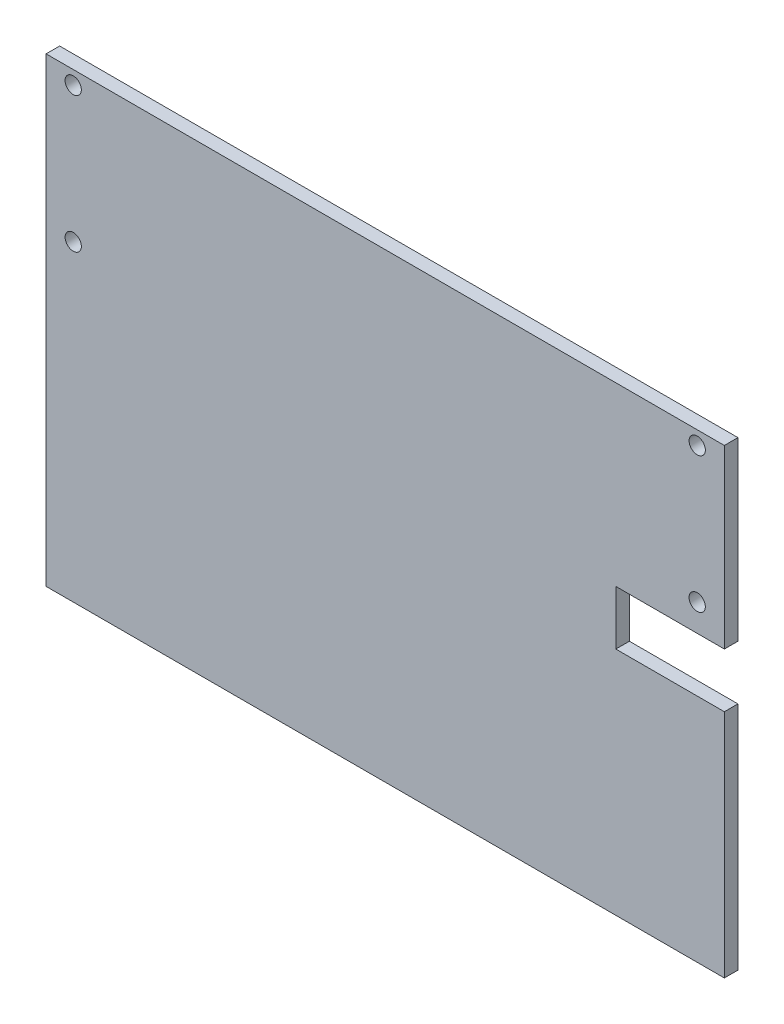
ISO-10303-21;
HEADER;
FILE_DESCRIPTION(('STEP AP214'),'2;1');
FILE_NAME('part.step','',(''),(''),'','','');
FILE_SCHEMA(('AUTOMOTIVE_DESIGN { 1 0 10303 214 1 1 1 1 }'));
ENDSEC;
DATA;
#1=APPLICATION_CONTEXT('core data for automotive mechanical design processes');
#2=APPLICATION_PROTOCOL_DEFINITION('international standard','automotive_design',2000,#1);
#3=PRODUCT_CONTEXT('',#1,'mechanical');
#4=PRODUCT('Part','Part','',(#3));
#5=PRODUCT_RELATED_PRODUCT_CATEGORY('part','',(#4));
#6=PRODUCT_DEFINITION_FORMATION('','',#4);
#7=PRODUCT_DEFINITION_CONTEXT('part definition',#1,'design');
#8=PRODUCT_DEFINITION('design','',#6,#7);
#9=PRODUCT_DEFINITION_SHAPE('','',#8);
#10=(LENGTH_UNIT() NAMED_UNIT(*) SI_UNIT(.MILLI.,.METRE.));
#11=(NAMED_UNIT(*) PLANE_ANGLE_UNIT() SI_UNIT($,.RADIAN.));
#12=(NAMED_UNIT(*) SI_UNIT($,.STERADIAN.) SOLID_ANGLE_UNIT());
#13=UNCERTAINTY_MEASURE_WITH_UNIT(LENGTH_MEASURE(1.E-05),#10,'distance_accuracy_value','');
#14=(GEOMETRIC_REPRESENTATION_CONTEXT(3) GLOBAL_UNCERTAINTY_ASSIGNED_CONTEXT((#13)) GLOBAL_UNIT_ASSIGNED_CONTEXT((#10,
#11,#12)) REPRESENTATION_CONTEXT('',''));
#15=CARTESIAN_POINT('',(0.,0.,0.));
#16=DIRECTION('',(0.,0.,1.));
#17=DIRECTION('',(1.,0.,0.));
#18=AXIS2_PLACEMENT_3D('',#15,#16,#17);
#19=CARTESIAN_POINT('',(250.,0.,5.));
#20=DIRECTION('',(-1.,0.,0.));
#21=DIRECTION('',(0.,0.,1.));
#22=AXIS2_PLACEMENT_3D('',#19,#20,#21);
#23=PLANE('',#22);
#24=DIRECTION('',(0.,1.,0.));
#25=VECTOR('',#24,1.);
#26=CARTESIAN_POINT('',(250.,0.,0.));
#27=LINE('',#26,#25);
#28=CARTESIAN_POINT('',(250.,-170.,0.));
#29=VERTEX_POINT('',#28);
#30=CARTESIAN_POINT('',(250.,-85.,0.));
#31=VERTEX_POINT('',#30);
#32=EDGE_CURVE('E143',#29,#31,#27,.T.);
#33=ORIENTED_EDGE('',*,*,#32,.T.);
#34=DIRECTION('',(0.,0.,1.));
#35=VECTOR('',#34,1.);
#36=CARTESIAN_POINT('',(250.,-85.,5.));
#37=LINE('',#36,#35);
#38=CARTESIAN_POINT('',(250.,-85.,5.));
#39=VERTEX_POINT('',#38);
#40=EDGE_CURVE('E41',#31,#39,#37,.T.);
#41=ORIENTED_EDGE('',*,*,#40,.T.);
#42=DIRECTION('',(0.,1.,0.));
#43=VECTOR('',#42,1.);
#44=CARTESIAN_POINT('',(250.,0.,5.));
#45=LINE('',#44,#43);
#46=CARTESIAN_POINT('',(250.,-170.,5.));
#47=VERTEX_POINT('',#46);
#48=EDGE_CURVE('E127',#47,#39,#45,.T.);
#49=ORIENTED_EDGE('',*,*,#48,.F.);
#50=DIRECTION('',(0.,0.,-1.));
#51=VECTOR('',#50,1.);
#52=CARTESIAN_POINT('',(250.,-170.,5.));
#53=LINE('',#52,#51);
#54=EDGE_CURVE('E149',#47,#29,#53,.T.);
#55=ORIENTED_EDGE('',*,*,#54,.T.);
#56=EDGE_LOOP('',(#33,#41,#49,#55));
#57=FACE_BOUND('',#56,.T.);
#58=ADVANCED_FACE('F33',(#57),#23,.F.);
#59=CARTESIAN_POINT('',(0.,0.,5.));
#60=DIRECTION('',(0.,0.,1.));
#61=DIRECTION('',(1.,0.,0.));
#62=AXIS2_PLACEMENT_3D('',#59,#60,#61);
#63=PLANE('',#62);
#64=DIRECTION('',(1.,0.,0.));
#65=VECTOR('',#64,1.);
#66=CARTESIAN_POINT('',(210.,-85.,5.));
#67=LINE('',#66,#65);
#68=CARTESIAN_POINT('',(210.,-85.,5.));
#69=VERTEX_POINT('',#68);
#70=EDGE_CURVE('E158',#69,#39,#67,.T.);
#71=ORIENTED_EDGE('',*,*,#70,.F.);
#72=DIRECTION('',(0.,-1.,0.));
#73=VECTOR('',#72,1.);
#74=CARTESIAN_POINT('',(210.,-65.,5.));
#75=LINE('',#74,#73);
#76=CARTESIAN_POINT('',(210.,-65.,5.));
#77=VERTEX_POINT('',#76);
#78=EDGE_CURVE('E123',#77,#69,#75,.T.);
#79=ORIENTED_EDGE('',*,*,#78,.F.);
#80=DIRECTION('',(-1.,0.,0.));
#81=VECTOR('',#80,1.);
#82=CARTESIAN_POINT('',(250.,-65.,5.));
#83=LINE('',#82,#81);
#84=CARTESIAN_POINT('',(250.,-65.,5.));
#85=VERTEX_POINT('',#84);
#86=EDGE_CURVE('E110',#85,#77,#83,.T.);
#87=ORIENTED_EDGE('',*,*,#86,.F.);
#88=CARTESIAN_POINT('',(250.,0.,5.));
#89=VERTEX_POINT('',#88);
#90=EDGE_CURVE('E120',#85,#89,#45,.T.);
#91=ORIENTED_EDGE('',*,*,#90,.T.);
#92=DIRECTION('',(-1.,0.,0.));
#93=VECTOR('',#92,1.);
#94=CARTESIAN_POINT('',(0.,0.,5.));
#95=LINE('',#94,#93);
#96=CARTESIAN_POINT('',(0.,0.,5.));
#97=VERTEX_POINT('',#96);
#98=EDGE_CURVE('E57',#89,#97,#95,.T.);
#99=ORIENTED_EDGE('',*,*,#98,.T.);
#100=DIRECTION('',(0.,-1.,0.));
#101=VECTOR('',#100,1.);
#102=CARTESIAN_POINT('',(0.,0.,5.));
#103=LINE('',#102,#101);
#104=CARTESIAN_POINT('',(0.,-170.,5.));
#105=VERTEX_POINT('',#104);
#106=EDGE_CURVE('E130',#97,#105,#103,.T.);
#107=ORIENTED_EDGE('',*,*,#106,.T.);
#108=DIRECTION('',(1.,0.,0.));
#109=VECTOR('',#108,1.);
#110=CARTESIAN_POINT('',(0.,-170.,5.));
#111=LINE('',#110,#109);
#112=EDGE_CURVE('E86',#105,#47,#111,.T.);
#113=ORIENTED_EDGE('',*,*,#112,.T.);
#114=ORIENTED_EDGE('',*,*,#48,.T.);
#115=EDGE_LOOP('',(#71,#79,#87,#91,#99,#107,#113,#114));
#116=FACE_BOUND('',#115,.T.);
#117=CARTESIAN_POINT('',(240.,-5.,5.));
#118=DIRECTION('',(0.,0.,1.));
#119=DIRECTION('',(-1.,0.,0.));
#120=AXIS2_PLACEMENT_3D('',#117,#118,#119);
#121=CIRCLE('',#120,3.00000000000002);
#122=CARTESIAN_POINT('',(237.,-5.,5.));
#123=VERTEX_POINT('',#122);
#124=EDGE_CURVE('E180',#123,#123,#121,.T.);
#125=ORIENTED_EDGE('',*,*,#124,.F.);
#126=EDGE_LOOP('',(#125));
#127=FACE_BOUND('',#126,.T.);
#128=CARTESIAN_POINT('',(10.,-55.,5.));
#129=DIRECTION('',(0.,0.,1.));
#130=DIRECTION('',(1.,0.,0.));
#131=AXIS2_PLACEMENT_3D('',#128,#129,#130);
#132=CIRCLE('',#131,3.);
#133=CARTESIAN_POINT('',(13.,-55.,5.));
#134=VERTEX_POINT('',#133);
#135=EDGE_CURVE('E140',#134,#134,#132,.T.);
#136=ORIENTED_EDGE('',*,*,#135,.F.);
#137=EDGE_LOOP('',(#136));
#138=FACE_BOUND('',#137,.T.);
#139=CARTESIAN_POINT('',(240.,-55.,5.));
#140=DIRECTION('',(0.,0.,1.));
#141=DIRECTION('',(-1.,0.,0.));
#142=AXIS2_PLACEMENT_3D('',#139,#140,#141);
#143=CIRCLE('',#142,2.99999999999997);
#144=CARTESIAN_POINT('',(237.,-55.,5.));
#145=VERTEX_POINT('',#144);
#146=EDGE_CURVE('E186',#145,#145,#143,.T.);
#147=ORIENTED_EDGE('',*,*,#146,.F.);
#148=EDGE_LOOP('',(#147));
#149=FACE_BOUND('',#148,.T.);
#150=CARTESIAN_POINT('',(10.,-5.,5.));
#151=DIRECTION('',(0.,0.,1.));
#152=DIRECTION('',(1.,0.,0.));
#153=AXIS2_PLACEMENT_3D('',#150,#151,#152);
#154=CIRCLE('',#153,3.);
#155=CARTESIAN_POINT('',(13.,-5.,5.));
#156=VERTEX_POINT('',#155);
#157=EDGE_CURVE('E171',#156,#156,#154,.T.);
#158=ORIENTED_EDGE('',*,*,#157,.F.);
#159=EDGE_LOOP('',(#158));
#160=FACE_BOUND('',#159,.T.);
#161=ADVANCED_FACE('F118',(#116,#127,#138,#149,#160),#63,.T.);
#162=CARTESIAN_POINT('',(0.,0.,0.));
#163=DIRECTION('',(0.,0.,1.));
#164=DIRECTION('',(1.,0.,0.));
#165=AXIS2_PLACEMENT_3D('',#162,#163,#164);
#166=PLANE('',#165);
#167=DIRECTION('',(0.,-1.,0.));
#168=VECTOR('',#167,1.);
#169=CARTESIAN_POINT('',(210.,0.,0.));
#170=LINE('',#169,#168);
#171=CARTESIAN_POINT('',(210.,-65.,0.));
#172=VERTEX_POINT('',#171);
#173=CARTESIAN_POINT('',(210.,-85.,0.));
#174=VERTEX_POINT('',#173);
#175=EDGE_CURVE('E11',#172,#174,#170,.T.);
#176=ORIENTED_EDGE('',*,*,#175,.T.);
#177=DIRECTION('',(1.,0.,0.));
#178=VECTOR('',#177,1.);
#179=CARTESIAN_POINT('',(0.,-85.,0.));
#180=LINE('',#179,#178);
#181=EDGE_CURVE('E166',#174,#31,#180,.T.);
#182=ORIENTED_EDGE('',*,*,#181,.T.);
#183=ORIENTED_EDGE('',*,*,#32,.F.);
#184=DIRECTION('',(1.,0.,0.));
#185=VECTOR('',#184,1.);
#186=CARTESIAN_POINT('',(0.,-170.,0.));
#187=LINE('',#186,#185);
#188=CARTESIAN_POINT('',(0.,-170.,0.));
#189=VERTEX_POINT('',#188);
#190=EDGE_CURVE('E139',#189,#29,#187,.T.);
#191=ORIENTED_EDGE('',*,*,#190,.F.);
#192=DIRECTION('',(0.,-1.,0.));
#193=VECTOR('',#192,1.);
#194=CARTESIAN_POINT('',(0.,0.,0.));
#195=LINE('',#194,#193);
#196=CARTESIAN_POINT('',(0.,0.,0.));
#197=VERTEX_POINT('',#196);
#198=EDGE_CURVE('E136',#197,#189,#195,.T.);
#199=ORIENTED_EDGE('',*,*,#198,.F.);
#200=DIRECTION('',(-1.,0.,0.));
#201=VECTOR('',#200,1.);
#202=CARTESIAN_POINT('',(0.,0.,0.));
#203=LINE('',#202,#201);
#204=CARTESIAN_POINT('',(250.,0.,0.));
#205=VERTEX_POINT('',#204);
#206=EDGE_CURVE('E78',#205,#197,#203,.T.);
#207=ORIENTED_EDGE('',*,*,#206,.F.);
#208=CARTESIAN_POINT('',(250.,-65.,0.));
#209=VERTEX_POINT('',#208);
#210=EDGE_CURVE('E142',#209,#205,#27,.T.);
#211=ORIENTED_EDGE('',*,*,#210,.F.);
#212=DIRECTION('',(-1.,0.,0.));
#213=VECTOR('',#212,1.);
#214=CARTESIAN_POINT('',(0.,-65.,0.));
#215=LINE('',#214,#213);
#216=EDGE_CURVE('E48',#209,#172,#215,.T.);
#217=ORIENTED_EDGE('',*,*,#216,.T.);
#218=EDGE_LOOP('',(#176,#182,#183,#191,#199,#207,#211,#217));
#219=FACE_BOUND('',#218,.T.);
#220=CARTESIAN_POINT('',(10.,-55.,0.));
#221=DIRECTION('',(0.,0.,1.));
#222=DIRECTION('',(1.,0.,0.));
#223=AXIS2_PLACEMENT_3D('',#220,#221,#222);
#224=CIRCLE('',#223,3.);
#225=CARTESIAN_POINT('',(13.,-55.,0.));
#226=VERTEX_POINT('',#225);
#227=EDGE_CURVE('E189',#226,#226,#224,.T.);
#228=ORIENTED_EDGE('',*,*,#227,.T.);
#229=EDGE_LOOP('',(#228));
#230=FACE_BOUND('',#229,.T.);
#231=CARTESIAN_POINT('',(240.,-55.,0.));
#232=DIRECTION('',(0.,0.,1.));
#233=DIRECTION('',(-1.,0.,0.));
#234=AXIS2_PLACEMENT_3D('',#231,#232,#233);
#235=CIRCLE('',#234,2.99999999999997);
#236=CARTESIAN_POINT('',(237.,-55.,0.));
#237=VERTEX_POINT('',#236);
#238=EDGE_CURVE('E183',#237,#237,#235,.T.);
#239=ORIENTED_EDGE('',*,*,#238,.T.);
#240=EDGE_LOOP('',(#239));
#241=FACE_BOUND('',#240,.T.);
#242=CARTESIAN_POINT('',(240.,-5.,0.));
#243=DIRECTION('',(0.,0.,1.));
#244=DIRECTION('',(-1.,0.,0.));
#245=AXIS2_PLACEMENT_3D('',#242,#243,#244);
#246=CIRCLE('',#245,3.00000000000002);
#247=CARTESIAN_POINT('',(237.,-5.,0.));
#248=VERTEX_POINT('',#247);
#249=EDGE_CURVE('E178',#248,#248,#246,.T.);
#250=ORIENTED_EDGE('',*,*,#249,.T.);
#251=EDGE_LOOP('',(#250));
#252=FACE_BOUND('',#251,.T.);
#253=CARTESIAN_POINT('',(10.,-5.,0.));
#254=DIRECTION('',(0.,0.,1.));
#255=DIRECTION('',(1.,0.,0.));
#256=AXIS2_PLACEMENT_3D('',#253,#254,#255);
#257=CIRCLE('',#256,3.);
#258=CARTESIAN_POINT('',(13.,-5.,0.));
#259=VERTEX_POINT('',#258);
#260=EDGE_CURVE('E168',#259,#259,#257,.T.);
#261=ORIENTED_EDGE('',*,*,#260,.T.);
#262=EDGE_LOOP('',(#261));
#263=FACE_BOUND('',#262,.T.);
#264=ADVANCED_FACE('F163',(#219,#230,#241,#252,#263),#166,.F.);
#265=CARTESIAN_POINT('',(0.,0.,5.));
#266=DIRECTION('',(1.,0.,0.));
#267=DIRECTION('',(0.,1.,0.));
#268=AXIS2_PLACEMENT_3D('',#265,#266,#267);
#269=PLANE('',#268);
#270=ORIENTED_EDGE('',*,*,#198,.T.);
#271=DIRECTION('',(0.,0.,-1.));
#272=VECTOR('',#271,1.);
#273=CARTESIAN_POINT('',(0.,-170.,5.));
#274=LINE('',#273,#272);
#275=EDGE_CURVE('E115',#105,#189,#274,.T.);
#276=ORIENTED_EDGE('',*,*,#275,.F.);
#277=ORIENTED_EDGE('',*,*,#106,.F.);
#278=DIRECTION('',(0.,0.,-1.));
#279=VECTOR('',#278,1.);
#280=CARTESIAN_POINT('',(0.,0.,5.));
#281=LINE('',#280,#279);
#282=EDGE_CURVE('E135',#97,#197,#281,.T.);
#283=ORIENTED_EDGE('',*,*,#282,.T.);
#284=EDGE_LOOP('',(#270,#276,#277,#283));
#285=FACE_BOUND('',#284,.T.);
#286=ADVANCED_FACE('F35',(#285),#269,.F.);
#287=CARTESIAN_POINT('',(0.,-170.,5.));
#288=DIRECTION('',(0.,1.,0.));
#289=DIRECTION('',(0.,0.,1.));
#290=AXIS2_PLACEMENT_3D('',#287,#288,#289);
#291=PLANE('',#290);
#292=ORIENTED_EDGE('',*,*,#190,.T.);
#293=ORIENTED_EDGE('',*,*,#54,.F.);
#294=ORIENTED_EDGE('',*,*,#112,.F.);
#295=ORIENTED_EDGE('',*,*,#275,.T.);
#296=EDGE_LOOP('',(#292,#293,#294,#295));
#297=FACE_BOUND('',#296,.T.);
#298=ADVANCED_FACE('F161',(#297),#291,.F.);
#299=ORIENTED_EDGE('',*,*,#90,.F.);
#300=DIRECTION('',(0.,0.,-1.));
#301=VECTOR('',#300,1.);
#302=CARTESIAN_POINT('',(250.,-65.,5.));
#303=LINE('',#302,#301);
#304=EDGE_CURVE('E107',#85,#209,#303,.T.);
#305=ORIENTED_EDGE('',*,*,#304,.T.);
#306=ORIENTED_EDGE('',*,*,#210,.T.);
#307=DIRECTION('',(0.,0.,-1.));
#308=VECTOR('',#307,1.);
#309=CARTESIAN_POINT('',(250.,0.,5.));
#310=LINE('',#309,#308);
#311=EDGE_CURVE('E126',#89,#205,#310,.T.);
#312=ORIENTED_EDGE('',*,*,#311,.F.);
#313=EDGE_LOOP('',(#299,#305,#306,#312));
#314=FACE_BOUND('',#313,.T.);
#315=ADVANCED_FACE('F125',(#314),#23,.F.);
#316=CARTESIAN_POINT('',(0.,0.,5.));
#317=DIRECTION('',(0.,-1.,0.));
#318=DIRECTION('',(0.,0.,-1.));
#319=AXIS2_PLACEMENT_3D('',#316,#317,#318);
#320=PLANE('',#319);
#321=ORIENTED_EDGE('',*,*,#206,.T.);
#322=ORIENTED_EDGE('',*,*,#282,.F.);
#323=ORIENTED_EDGE('',*,*,#98,.F.);
#324=ORIENTED_EDGE('',*,*,#311,.T.);
#325=EDGE_LOOP('',(#321,#322,#323,#324));
#326=FACE_BOUND('',#325,.T.);
#327=ADVANCED_FACE('F201',(#326),#320,.F.);
#328=CARTESIAN_POINT('',(10.,-55.,5.));
#329=DIRECTION('',(0.,0.,-1.));
#330=DIRECTION('',(-1.,0.,0.));
#331=AXIS2_PLACEMENT_3D('',#328,#329,#330);
#332=CYLINDRICAL_SURFACE('',#331,3.);
#333=ORIENTED_EDGE('',*,*,#135,.T.);
#334=EDGE_LOOP('',(#333));
#335=FACE_BOUND('',#334,.T.);
#336=ORIENTED_EDGE('',*,*,#227,.F.);
#337=EDGE_LOOP('',(#336));
#338=FACE_BOUND('',#337,.T.);
#339=ADVANCED_FACE('F198',(#335,#338),#332,.F.);
#340=CARTESIAN_POINT('',(240.,-55.,5.));
#341=DIRECTION('',(0.,0.,-1.));
#342=DIRECTION('',(-1.,0.,0.));
#343=AXIS2_PLACEMENT_3D('',#340,#341,#342);
#344=CYLINDRICAL_SURFACE('',#343,2.99999999999997);
#345=ORIENTED_EDGE('',*,*,#146,.T.);
#346=EDGE_LOOP('',(#345));
#347=FACE_BOUND('',#346,.T.);
#348=ORIENTED_EDGE('',*,*,#238,.F.);
#349=EDGE_LOOP('',(#348));
#350=FACE_BOUND('',#349,.T.);
#351=ADVANCED_FACE('F200',(#347,#350),#344,.F.);
#352=CARTESIAN_POINT('',(240.,-5.,5.));
#353=DIRECTION('',(0.,0.,-1.));
#354=DIRECTION('',(-1.,0.,0.));
#355=AXIS2_PLACEMENT_3D('',#352,#353,#354);
#356=CYLINDRICAL_SURFACE('',#355,3.00000000000002);
#357=ORIENTED_EDGE('',*,*,#124,.T.);
#358=EDGE_LOOP('',(#357));
#359=FACE_BOUND('',#358,.T.);
#360=ORIENTED_EDGE('',*,*,#249,.F.);
#361=EDGE_LOOP('',(#360));
#362=FACE_BOUND('',#361,.T.);
#363=ADVANCED_FACE('F208',(#359,#362),#356,.F.);
#364=CARTESIAN_POINT('',(10.,-5.,5.));
#365=DIRECTION('',(0.,0.,-1.));
#366=DIRECTION('',(-1.,0.,0.));
#367=AXIS2_PLACEMENT_3D('',#364,#365,#366);
#368=CYLINDRICAL_SURFACE('',#367,3.);
#369=ORIENTED_EDGE('',*,*,#157,.T.);
#370=EDGE_LOOP('',(#369));
#371=FACE_BOUND('',#370,.T.);
#372=ORIENTED_EDGE('',*,*,#260,.F.);
#373=EDGE_LOOP('',(#372));
#374=FACE_BOUND('',#373,.T.);
#375=ADVANCED_FACE('F247',(#371,#374),#368,.F.);
#376=CARTESIAN_POINT('',(210.,-65.,-5.));
#377=DIRECTION('',(-1.,0.,0.));
#378=DIRECTION('',(0.,0.,1.));
#379=AXIS2_PLACEMENT_3D('',#376,#377,#378);
#380=PLANE('',#379);
#381=DIRECTION('',(0.,0.,1.));
#382=VECTOR('',#381,1.);
#383=CARTESIAN_POINT('',(210.,-65.,-5.));
#384=LINE('',#383,#382);
#385=EDGE_CURVE('E320',#172,#77,#384,.T.);
#386=ORIENTED_EDGE('',*,*,#385,.T.);
#387=ORIENTED_EDGE('',*,*,#78,.T.);
#388=DIRECTION('',(0.,0.,1.));
#389=VECTOR('',#388,1.);
#390=CARTESIAN_POINT('',(210.,-85.,-5.));
#391=LINE('',#390,#389);
#392=EDGE_CURVE('E173',#174,#69,#391,.T.);
#393=ORIENTED_EDGE('',*,*,#392,.F.);
#394=ORIENTED_EDGE('',*,*,#175,.F.);
#395=EDGE_LOOP('',(#386,#387,#393,#394));
#396=FACE_BOUND('',#395,.T.);
#397=ADVANCED_FACE('F251',(#396),#380,.F.);
#398=CARTESIAN_POINT('',(210.,-85.,-5.));
#399=DIRECTION('',(0.,-1.,0.));
#400=DIRECTION('',(0.,0.,-1.));
#401=AXIS2_PLACEMENT_3D('',#398,#399,#400);
#402=PLANE('',#401);
#403=ORIENTED_EDGE('',*,*,#392,.T.);
#404=ORIENTED_EDGE('',*,*,#70,.T.);
#405=ORIENTED_EDGE('',*,*,#40,.F.);
#406=ORIENTED_EDGE('',*,*,#181,.F.);
#407=EDGE_LOOP('',(#403,#404,#405,#406));
#408=FACE_BOUND('',#407,.T.);
#409=ADVANCED_FACE('F299',(#408),#402,.F.);
#410=CARTESIAN_POINT('',(250.,-65.,-5.));
#411=DIRECTION('',(0.,1.,0.));
#412=DIRECTION('',(0.,0.,1.));
#413=AXIS2_PLACEMENT_3D('',#410,#411,#412);
#414=PLANE('',#413);
#415=ORIENTED_EDGE('',*,*,#304,.F.);
#416=ORIENTED_EDGE('',*,*,#86,.T.);
#417=ORIENTED_EDGE('',*,*,#385,.F.);
#418=ORIENTED_EDGE('',*,*,#216,.F.);
#419=EDGE_LOOP('',(#415,#416,#417,#418));
#420=FACE_BOUND('',#419,.T.);
#421=ADVANCED_FACE('F109',(#420),#414,.F.);
#422=CLOSED_SHELL('',(#58,#161,#264,#286,#298,#315,#327,#339,#351,#363,#375,#397,#409,#421));
#423=MANIFOLD_SOLID_BREP('B2',#422);
#424=ADVANCED_BREP_SHAPE_REPRESENTATION('',(#18,#423),#14);
#425=SHAPE_DEFINITION_REPRESENTATION(#9,#424);
ENDSEC;
END-ISO-10303-21;
